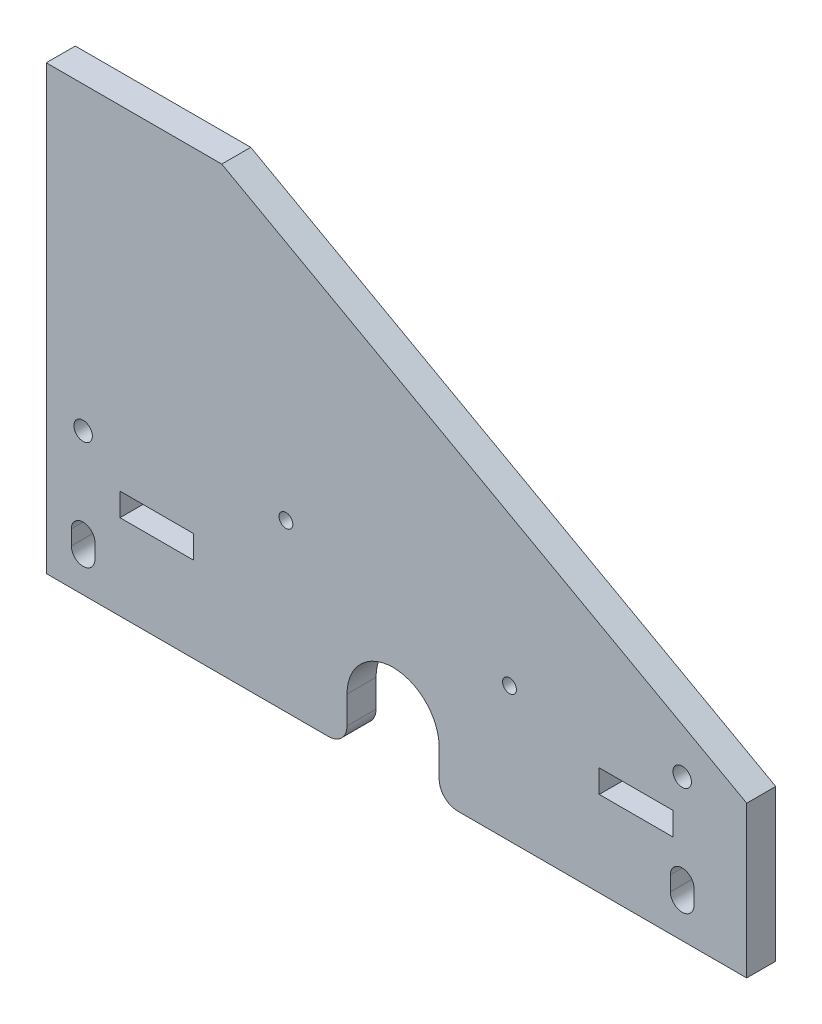
ISO-10303-21;
HEADER;
FILE_DESCRIPTION(('STEP AP214'),'2;1');
FILE_NAME('part.step','',(''),(''),'','','');
FILE_SCHEMA(('AUTOMOTIVE_DESIGN { 1 0 10303 214 1 1 1 1 }'));
ENDSEC;
DATA;
#1=APPLICATION_CONTEXT('core data for automotive mechanical design processes');
#2=APPLICATION_PROTOCOL_DEFINITION('international standard','automotive_design',2000,#1);
#3=PRODUCT_CONTEXT('',#1,'mechanical');
#4=PRODUCT('Part','Part','',(#3));
#5=PRODUCT_RELATED_PRODUCT_CATEGORY('part','',(#4));
#6=PRODUCT_DEFINITION_FORMATION('','',#4);
#7=PRODUCT_DEFINITION_CONTEXT('part definition',#1,'design');
#8=PRODUCT_DEFINITION('design','',#6,#7);
#9=PRODUCT_DEFINITION_SHAPE('','',#8);
#10=(LENGTH_UNIT() NAMED_UNIT(*) SI_UNIT(.MILLI.,.METRE.));
#11=(NAMED_UNIT(*) PLANE_ANGLE_UNIT() SI_UNIT($,.RADIAN.));
#12=(NAMED_UNIT(*) SI_UNIT($,.STERADIAN.) SOLID_ANGLE_UNIT());
#13=UNCERTAINTY_MEASURE_WITH_UNIT(LENGTH_MEASURE(1.E-05),#10,'distance_accuracy_value','');
#14=(GEOMETRIC_REPRESENTATION_CONTEXT(3) GLOBAL_UNCERTAINTY_ASSIGNED_CONTEXT((#13)) GLOBAL_UNIT_ASSIGNED_CONTEXT((#10,
#11,#12)) REPRESENTATION_CONTEXT('',''));
#15=CARTESIAN_POINT('',(0.,0.,0.));
#16=DIRECTION('',(0.,0.,1.));
#17=DIRECTION('',(1.,0.,0.));
#18=AXIS2_PLACEMENT_3D('',#15,#16,#17);
#19=CARTESIAN_POINT('',(-202.37863207058,-24.581916587002,10.));
#20=DIRECTION('',(0.,1.,0.));
#21=DIRECTION('',(0.,0.,1.));
#22=AXIS2_PLACEMENT_3D('',#19,#20,#21);
#23=PLANE('',#22);
#24=DIRECTION('',(0.,0.,1.));
#25=VECTOR('',#24,1.);
#26=CARTESIAN_POINT('',(-105.11949207058,-24.581916587002,0.));
#27=LINE('',#26,#25);
#28=CARTESIAN_POINT('',(-105.11949207058,-24.581916587002,0.));
#29=VERTEX_POINT('',#28);
#30=CARTESIAN_POINT('',(-105.11949207058,-24.581916587002,10.));
#31=VERTEX_POINT('',#30);
#32=EDGE_CURVE('E260',#29,#31,#27,.T.);
#33=ORIENTED_EDGE('',*,*,#32,.T.);
#34=DIRECTION('',(1.,0.,0.));
#35=VECTOR('',#34,1.);
#36=CARTESIAN_POINT('',(-202.37863207058,-24.581916587002,10.));
#37=LINE('',#36,#35);
#38=CARTESIAN_POINT('',(-202.37863207058,-24.581916587002,10.));
#39=VERTEX_POINT('',#38);
#40=EDGE_CURVE('E422',#39,#31,#37,.T.);
#41=ORIENTED_EDGE('',*,*,#40,.F.);
#42=DIRECTION('',(0.,0.,-1.));
#43=VECTOR('',#42,1.);
#44=CARTESIAN_POINT('',(-202.37863207058,-24.581916587002,10.));
#45=LINE('',#44,#43);
#46=CARTESIAN_POINT('',(-202.37863207058,-24.581916587002,0.));
#47=VERTEX_POINT('',#46);
#48=EDGE_CURVE('E439',#39,#47,#45,.T.);
#49=ORIENTED_EDGE('',*,*,#48,.T.);
#50=DIRECTION('',(1.,0.,0.));
#51=VECTOR('',#50,1.);
#52=CARTESIAN_POINT('',(-202.37863207058,-24.581916587002,0.));
#53=LINE('',#52,#51);
#54=EDGE_CURVE('E415',#47,#29,#53,.T.);
#55=ORIENTED_EDGE('',*,*,#54,.T.);
#56=EDGE_LOOP('',(#33,#41,#49,#55));
#57=FACE_BOUND('',#56,.T.);
#58=ADVANCED_FACE('F33',(#57),#23,.F.);
#59=CARTESIAN_POINT('',(38.9213679294199,27.5724000758674,10.));
#60=DIRECTION('',(-1.,0.,0.));
#61=DIRECTION('',(0.,0.,1.));
#62=AXIS2_PLACEMENT_3D('',#59,#60,#61);
#63=PLANE('',#62);
#64=DIRECTION('',(0.,1.,0.));
#65=VECTOR('',#64,1.);
#66=CARTESIAN_POINT('',(38.9213679294199,27.5724000758674,0.));
#67=LINE('',#66,#65);
#68=CARTESIAN_POINT('',(38.9213679294199,-24.581916587002,0.));
#69=VERTEX_POINT('',#68);
#70=CARTESIAN_POINT('',(38.9213679294199,27.5724000758674,0.));
#71=VERTEX_POINT('',#70);
#72=EDGE_CURVE('E410',#69,#71,#67,.T.);
#73=ORIENTED_EDGE('',*,*,#72,.T.);
#74=DIRECTION('',(0.,0.,-1.));
#75=VECTOR('',#74,1.);
#76=CARTESIAN_POINT('',(38.9213679294199,27.5724000758674,10.));
#77=LINE('',#76,#75);
#78=CARTESIAN_POINT('',(38.9213679294199,27.5724000758674,10.));
#79=VERTEX_POINT('',#78);
#80=EDGE_CURVE('E11',#79,#71,#77,.T.);
#81=ORIENTED_EDGE('',*,*,#80,.F.);
#82=DIRECTION('',(0.,1.,0.));
#83=VECTOR('',#82,1.);
#84=CARTESIAN_POINT('',(38.9213679294199,27.5724000758674,10.));
#85=LINE('',#84,#83);
#86=CARTESIAN_POINT('',(38.9213679294199,-24.581916587002,10.));
#87=VERTEX_POINT('',#86);
#88=EDGE_CURVE('E411',#87,#79,#85,.T.);
#89=ORIENTED_EDGE('',*,*,#88,.F.);
#90=DIRECTION('',(0.,0.,-1.));
#91=VECTOR('',#90,1.);
#92=CARTESIAN_POINT('',(38.9213679294199,-24.581916587002,10.));
#93=LINE('',#92,#91);
#94=EDGE_CURVE('E425',#87,#69,#93,.T.);
#95=ORIENTED_EDGE('',*,*,#94,.T.);
#96=EDGE_LOOP('',(#73,#81,#89,#95));
#97=FACE_BOUND('',#96,.T.);
#98=ADVANCED_FACE('F35',(#97),#63,.F.);
#99=CARTESIAN_POINT('',(-141.92663207058,127.818083412998,10.));
#100=DIRECTION('',(-0.484809620246338,-0.874619707139395,0.));
#101=DIRECTION('',(0.874619707139395,-0.484809620246338,0.));
#102=AXIS2_PLACEMENT_3D('',#99,#100,#101);
#103=PLANE('',#102);
#104=DIRECTION('',(-0.874619707139395,0.484809620246338,0.));
#105=VECTOR('',#104,1.);
#106=CARTESIAN_POINT('',(-141.92663207058,127.818083412998,0.));
#107=LINE('',#106,#105);
#108=CARTESIAN_POINT('',(-141.92663207058,127.818083412998,0.));
#109=VERTEX_POINT('',#108);
#110=EDGE_CURVE('E428',#71,#109,#107,.T.);
#111=ORIENTED_EDGE('',*,*,#110,.T.);
#112=DIRECTION('',(0.,0.,-1.));
#113=VECTOR('',#112,1.);
#114=CARTESIAN_POINT('',(-141.92663207058,127.818083412998,10.));
#115=LINE('',#114,#113);
#116=CARTESIAN_POINT('',(-141.92663207058,127.818083412998,10.));
#117=VERTEX_POINT('',#116);
#118=EDGE_CURVE('E41',#117,#109,#115,.T.);
#119=ORIENTED_EDGE('',*,*,#118,.F.);
#120=DIRECTION('',(-0.874619707139395,0.484809620246338,0.));
#121=VECTOR('',#120,1.);
#122=CARTESIAN_POINT('',(-141.92663207058,127.818083412998,10.));
#123=LINE('',#122,#121);
#124=EDGE_CURVE('E414',#79,#117,#123,.T.);
#125=ORIENTED_EDGE('',*,*,#124,.F.);
#126=ORIENTED_EDGE('',*,*,#80,.T.);
#127=EDGE_LOOP('',(#111,#119,#125,#126));
#128=FACE_BOUND('',#127,.T.);
#129=ADVANCED_FACE('F468',(#128),#103,.F.);
#130=CARTESIAN_POINT('',(-202.37863207058,127.818083412998,10.));
#131=DIRECTION('',(0.,-1.,0.));
#132=DIRECTION('',(0.,0.,-1.));
#133=AXIS2_PLACEMENT_3D('',#130,#131,#132);
#134=PLANE('',#133);
#135=DIRECTION('',(-1.,0.,0.));
#136=VECTOR('',#135,1.);
#137=CARTESIAN_POINT('',(-202.37863207058,127.818083412998,0.));
#138=LINE('',#137,#136);
#139=CARTESIAN_POINT('',(-202.37863207058,127.818083412998,0.));
#140=VERTEX_POINT('',#139);
#141=EDGE_CURVE('E430',#109,#140,#138,.T.);
#142=ORIENTED_EDGE('',*,*,#141,.T.);
#143=DIRECTION('',(0.,0.,-1.));
#144=VECTOR('',#143,1.);
#145=CARTESIAN_POINT('',(-202.37863207058,127.818083412998,10.));
#146=LINE('',#145,#144);
#147=CARTESIAN_POINT('',(-202.37863207058,127.818083412998,10.));
#148=VERTEX_POINT('',#147);
#149=EDGE_CURVE('E442',#148,#140,#146,.T.);
#150=ORIENTED_EDGE('',*,*,#149,.F.);
#151=DIRECTION('',(-1.,0.,0.));
#152=VECTOR('',#151,1.);
#153=CARTESIAN_POINT('',(-202.37863207058,127.818083412998,10.));
#154=LINE('',#153,#152);
#155=EDGE_CURVE('E417',#117,#148,#154,.T.);
#156=ORIENTED_EDGE('',*,*,#155,.F.);
#157=ORIENTED_EDGE('',*,*,#118,.T.);
#158=EDGE_LOOP('',(#142,#150,#156,#157));
#159=FACE_BOUND('',#158,.T.);
#160=ADVANCED_FACE('F449',(#159),#134,.F.);
#161=CARTESIAN_POINT('',(-202.37863207058,127.818083412998,10.));
#162=DIRECTION('',(1.,0.,0.));
#163=DIRECTION('',(0.,1.,0.));
#164=AXIS2_PLACEMENT_3D('',#161,#162,#163);
#165=PLANE('',#164);
#166=DIRECTION('',(0.,-1.,0.));
#167=VECTOR('',#166,1.);
#168=CARTESIAN_POINT('',(-202.37863207058,127.818083412998,0.));
#169=LINE('',#168,#167);
#170=EDGE_CURVE('E432',#140,#47,#169,.T.);
#171=ORIENTED_EDGE('',*,*,#170,.T.);
#172=ORIENTED_EDGE('',*,*,#48,.F.);
#173=DIRECTION('',(0.,-1.,0.));
#174=VECTOR('',#173,1.);
#175=CARTESIAN_POINT('',(-202.37863207058,127.818083412998,10.));
#176=LINE('',#175,#174);
#177=EDGE_CURVE('E419',#148,#39,#176,.T.);
#178=ORIENTED_EDGE('',*,*,#177,.F.);
#179=ORIENTED_EDGE('',*,*,#149,.T.);
#180=EDGE_LOOP('',(#171,#172,#178,#179));
#181=FACE_BOUND('',#180,.T.);
#182=ADVANCED_FACE('F457',(#181),#165,.F.);
#183=CARTESIAN_POINT('',(-60.6694920705801,-24.581916587002,10.));
#184=VERTEX_POINT('',#183);
#185=EDGE_CURVE('E421',#184,#87,#37,.T.);
#186=ORIENTED_EDGE('',*,*,#185,.F.);
#187=DIRECTION('',(0.,0.,1.));
#188=VECTOR('',#187,1.);
#189=CARTESIAN_POINT('',(-60.6694920705801,-24.581916587002,0.));
#190=LINE('',#189,#188);
#191=CARTESIAN_POINT('',(-60.6694920705801,-24.581916587002,0.));
#192=VERTEX_POINT('',#191);
#193=EDGE_CURVE('E258',#192,#184,#190,.T.);
#194=ORIENTED_EDGE('',*,*,#193,.F.);
#195=EDGE_CURVE('E434',#192,#69,#53,.T.);
#196=ORIENTED_EDGE('',*,*,#195,.T.);
#197=ORIENTED_EDGE('',*,*,#94,.F.);
#198=EDGE_LOOP('',(#186,#194,#196,#197));
#199=FACE_BOUND('',#198,.T.);
#200=ADVANCED_FACE('F474',(#199),#23,.F.);
#201=CARTESIAN_POINT('',(38.9213679294199,-24.581916587002,10.));
#202=DIRECTION('',(0.,0.,1.));
#203=DIRECTION('',(1.,0.,0.));
#204=AXIS2_PLACEMENT_3D('',#201,#202,#203);
#205=PLANE('',#204);
#206=CARTESIAN_POINT('',(-60.6694920705801,-18.231916587002,10.));
#207=DIRECTION('',(0.,0.,-1.));
#208=DIRECTION('',(1.,0.,0.));
#209=AXIS2_PLACEMENT_3D('',#206,#207,#208);
#210=CIRCLE('',#209,6.35);
#211=CARTESIAN_POINT('',(-67.0194920705801,-18.231916587002,10.));
#212=VERTEX_POINT('',#211);
#213=EDGE_CURVE('E239',#184,#212,#210,.T.);
#214=ORIENTED_EDGE('',*,*,#213,.F.);
#215=ORIENTED_EDGE('',*,*,#185,.T.);
#216=ORIENTED_EDGE('',*,*,#88,.T.);
#217=ORIENTED_EDGE('',*,*,#124,.T.);
#218=ORIENTED_EDGE('',*,*,#155,.T.);
#219=ORIENTED_EDGE('',*,*,#177,.T.);
#220=ORIENTED_EDGE('',*,*,#40,.T.);
#221=CARTESIAN_POINT('',(-105.11949207058,-18.231916587002,10.));
#222=DIRECTION('',(0.,0.,-1.));
#223=DIRECTION('',(1.,0.,0.));
#224=AXIS2_PLACEMENT_3D('',#221,#222,#223);
#225=CIRCLE('',#224,6.35);
#226=CARTESIAN_POINT('',(-98.7694920705801,-18.231916587002,10.));
#227=VERTEX_POINT('',#226);
#228=EDGE_CURVE('E249',#227,#31,#225,.T.);
#229=ORIENTED_EDGE('',*,*,#228,.F.);
#230=DIRECTION('',(0.,-1.,0.));
#231=VECTOR('',#230,1.);
#232=CARTESIAN_POINT('',(-98.7694920705801,-8.70691658700201,10.));
#233=LINE('',#232,#231);
#234=CARTESIAN_POINT('',(-98.7694920705801,-8.70691658700201,10.));
#235=VERTEX_POINT('',#234);
#236=EDGE_CURVE('E247',#235,#227,#233,.T.);
#237=ORIENTED_EDGE('',*,*,#236,.F.);
#238=CARTESIAN_POINT('',(-82.8944920705801,-8.70691658700201,10.));
#239=DIRECTION('',(0.,0.,1.));
#240=DIRECTION('',(1.,0.,0.));
#241=AXIS2_PLACEMENT_3D('',#238,#239,#240);
#242=CIRCLE('',#241,15.875);
#243=CARTESIAN_POINT('',(-67.0194920705801,-8.70691658700201,10.));
#244=VERTEX_POINT('',#243);
#245=EDGE_CURVE('E219',#244,#235,#242,.T.);
#246=ORIENTED_EDGE('',*,*,#245,.F.);
#247=DIRECTION('',(0.,1.,0.));
#248=VECTOR('',#247,1.);
#249=CARTESIAN_POINT('',(-67.0194920705801,-8.70691658700201,10.));
#250=LINE('',#249,#248);
#251=EDGE_CURVE('E236',#212,#244,#250,.T.);
#252=ORIENTED_EDGE('',*,*,#251,.F.);
#253=EDGE_LOOP('',(#214,#215,#216,#217,#218,#219,#220,#229,#237,#246,#252));
#254=FACE_BOUND('',#253,.T.);
#255=CARTESIAN_POINT('',(16.6963679294199,24.358803412998,10.));
#256=DIRECTION('',(0.,0.,1.));
#257=DIRECTION('',(1.,0.,0.));
#258=AXIS2_PLACEMENT_3D('',#255,#256,#257);
#259=CIRCLE('',#258,3.175);
#260=CARTESIAN_POINT('',(19.8713679294199,24.358803412998,10.));
#261=VERTEX_POINT('',#260);
#262=EDGE_CURVE('E255',#261,#261,#259,.T.);
#263=ORIENTED_EDGE('',*,*,#262,.F.);
#264=EDGE_LOOP('',(#263));
#265=FACE_BOUND('',#264,.T.);
#266=CARTESIAN_POINT('',(16.6963679294199,-12.008916587002,10.));
#267=DIRECTION('',(0.,0.,1.));
#268=DIRECTION('',(1.,0.,0.));
#269=AXIS2_PLACEMENT_3D('',#266,#267,#268);
#270=CIRCLE('',#269,4.06400000000003);
#271=CARTESIAN_POINT('',(12.6323679294199,-12.008916587002,10.));
#272=VERTEX_POINT('',#271);
#273=CARTESIAN_POINT('',(20.76036792942,-12.008916587002,10.));
#274=VERTEX_POINT('',#273);
#275=EDGE_CURVE('E56',#272,#274,#270,.T.);
#276=ORIENTED_EDGE('',*,*,#275,.F.);
#277=DIRECTION('',(0.,-1.,0.));
#278=VECTOR('',#277,1.);
#279=CARTESIAN_POINT('',(12.6323679294199,-12.008916587002,10.));
#280=LINE('',#279,#278);
#281=CARTESIAN_POINT('',(12.6323679294199,-6.92891658700202,10.));
#282=VERTEX_POINT('',#281);
#283=EDGE_CURVE('E284',#282,#272,#280,.T.);
#284=ORIENTED_EDGE('',*,*,#283,.F.);
#285=CARTESIAN_POINT('',(16.6963679294199,-6.92891658700202,10.));
#286=DIRECTION('',(0.,0.,1.));
#287=DIRECTION('',(1.,0.,0.));
#288=AXIS2_PLACEMENT_3D('',#285,#286,#287);
#289=CIRCLE('',#288,4.06400000000004);
#290=CARTESIAN_POINT('',(20.76036792942,-6.92891658700202,10.));
#291=VERTEX_POINT('',#290);
#292=EDGE_CURVE('E281',#291,#282,#289,.T.);
#293=ORIENTED_EDGE('',*,*,#292,.F.);
#294=DIRECTION('',(0.,1.,0.));
#295=VECTOR('',#294,1.);
#296=CARTESIAN_POINT('',(20.76036792942,-6.92891658700202,10.));
#297=LINE('',#296,#295);
#298=EDGE_CURVE('E278',#274,#291,#297,.T.);
#299=ORIENTED_EDGE('',*,*,#298,.F.);
#300=EDGE_LOOP('',(#276,#284,#293,#299));
#301=FACE_BOUND('',#300,.T.);
#302=DIRECTION('',(0.,1.,0.));
#303=VECTOR('',#302,1.);
#304=CARTESIAN_POINT('',(13.5213679294199,12.725603412998,10.));
#305=LINE('',#304,#303);
#306=CARTESIAN_POINT('',(13.5213679294199,4.78810341299798,10.));
#307=VERTEX_POINT('',#306);
#308=CARTESIAN_POINT('',(13.5213679294199,12.725603412998,10.));
#309=VERTEX_POINT('',#308);
#310=EDGE_CURVE('E298',#307,#309,#305,.T.);
#311=ORIENTED_EDGE('',*,*,#310,.F.);
#312=DIRECTION('',(1.,0.,0.));
#313=VECTOR('',#312,1.);
#314=CARTESIAN_POINT('',(13.5213679294199,4.78810341299798,10.));
#315=LINE('',#314,#313);
#316=CARTESIAN_POINT('',(-11.87863207058,4.78810341299798,10.));
#317=VERTEX_POINT('',#316);
#318=EDGE_CURVE('E303',#317,#307,#315,.T.);
#319=ORIENTED_EDGE('',*,*,#318,.F.);
#320=DIRECTION('',(0.,-1.,0.));
#321=VECTOR('',#320,1.);
#322=CARTESIAN_POINT('',(-11.87863207058,12.725603412998,10.));
#323=LINE('',#322,#321);
#324=CARTESIAN_POINT('',(-11.87863207058,12.725603412998,10.));
#325=VERTEX_POINT('',#324);
#326=EDGE_CURVE('E317',#325,#317,#323,.T.);
#327=ORIENTED_EDGE('',*,*,#326,.F.);
#328=DIRECTION('',(-1.,0.,0.));
#329=VECTOR('',#328,1.);
#330=CARTESIAN_POINT('',(13.5213679294199,12.725603412998,10.));
#331=LINE('',#330,#329);
#332=EDGE_CURVE('E314',#309,#325,#331,.T.);
#333=ORIENTED_EDGE('',*,*,#332,.F.);
#334=EDGE_LOOP('',(#311,#319,#327,#333));
#335=FACE_BOUND('',#334,.T.);
#336=CARTESIAN_POINT('',(-42.7929720705801,21.773083412998,10.));
#337=DIRECTION('',(0.,0.,1.));
#338=DIRECTION('',(1.,0.,0.));
#339=AXIS2_PLACEMENT_3D('',#336,#337,#338);
#340=CIRCLE('',#339,2.38125000000001);
#341=CARTESIAN_POINT('',(-40.4117220705801,21.773083412998,10.));
#342=VERTEX_POINT('',#341);
#343=EDGE_CURVE('E324',#342,#342,#340,.T.);
#344=ORIENTED_EDGE('',*,*,#343,.F.);
#345=EDGE_LOOP('',(#344));
#346=FACE_BOUND('',#345,.T.);
#347=CARTESIAN_POINT('',(-119.82863207058,32.568083412998,10.));
#348=DIRECTION('',(0.,0.,1.));
#349=DIRECTION('',(1.,0.,0.));
#350=AXIS2_PLACEMENT_3D('',#347,#348,#349);
#351=CIRCLE('',#350,2.38125);
#352=CARTESIAN_POINT('',(-117.44738207058,32.568083412998,10.));
#353=VERTEX_POINT('',#352);
#354=EDGE_CURVE('E334',#353,#353,#351,.T.);
#355=ORIENTED_EDGE('',*,*,#354,.F.);
#356=EDGE_LOOP('',(#355));
#357=FACE_BOUND('',#356,.T.);
#358=CARTESIAN_POINT('',(-189.67863207058,24.358803412998,10.));
#359=DIRECTION('',(0.,0.,1.));
#360=DIRECTION('',(1.,0.,0.));
#361=AXIS2_PLACEMENT_3D('',#358,#359,#360);
#362=CIRCLE('',#361,3.175);
#363=CARTESIAN_POINT('',(-186.50363207058,24.358803412998,10.));
#364=VERTEX_POINT('',#363);
#365=EDGE_CURVE('E340',#364,#364,#362,.T.);
#366=ORIENTED_EDGE('',*,*,#365,.F.);
#367=EDGE_LOOP('',(#366));
#368=FACE_BOUND('',#367,.T.);
#369=CARTESIAN_POINT('',(-189.67863207058,-12.008916587002,10.));
#370=DIRECTION('',(0.,0.,1.));
#371=DIRECTION('',(1.,0.,0.));
#372=AXIS2_PLACEMENT_3D('',#369,#370,#371);
#373=CIRCLE('',#372,4.06400000000003);
#374=CARTESIAN_POINT('',(-193.74263207058,-12.008916587002,10.));
#375=VERTEX_POINT('',#374);
#376=CARTESIAN_POINT('',(-185.61463207058,-12.008916587002,10.));
#377=VERTEX_POINT('',#376);
#378=EDGE_CURVE('E356',#375,#377,#373,.T.);
#379=ORIENTED_EDGE('',*,*,#378,.F.);
#380=DIRECTION('',(0.,-1.,0.));
#381=VECTOR('',#380,1.);
#382=CARTESIAN_POINT('',(-193.74263207058,-12.008916587002,10.));
#383=LINE('',#382,#381);
#384=CARTESIAN_POINT('',(-193.74263207058,-6.92891658700202,10.));
#385=VERTEX_POINT('',#384);
#386=EDGE_CURVE('E364',#385,#375,#383,.T.);
#387=ORIENTED_EDGE('',*,*,#386,.F.);
#388=CARTESIAN_POINT('',(-189.67863207058,-6.92891658700202,10.));
#389=DIRECTION('',(0.,0.,1.));
#390=DIRECTION('',(1.,0.,0.));
#391=AXIS2_PLACEMENT_3D('',#388,#389,#390);
#392=CIRCLE('',#391,4.06400000000004);
#393=CARTESIAN_POINT('',(-185.61463207058,-6.92891658700202,10.));
#394=VERTEX_POINT('',#393);
#395=EDGE_CURVE('E361',#394,#385,#392,.T.);
#396=ORIENTED_EDGE('',*,*,#395,.F.);
#397=DIRECTION('',(0.,1.,0.));
#398=VECTOR('',#397,1.);
#399=CARTESIAN_POINT('',(-185.61463207058,-6.92891658700202,10.));
#400=LINE('',#399,#398);
#401=EDGE_CURVE('E358',#377,#394,#400,.T.);
#402=ORIENTED_EDGE('',*,*,#401,.F.);
#403=EDGE_LOOP('',(#379,#387,#396,#402));
#404=FACE_BOUND('',#403,.T.);
#405=DIRECTION('',(0.,-1.,0.));
#406=VECTOR('',#405,1.);
#407=CARTESIAN_POINT('',(-176.97863207058,4.78810341299798,10.));
#408=LINE('',#407,#406);
#409=CARTESIAN_POINT('',(-176.97863207058,12.725603412998,10.));
#410=VERTEX_POINT('',#409);
#411=CARTESIAN_POINT('',(-176.97863207058,4.78810341299798,10.));
#412=VERTEX_POINT('',#411);
#413=EDGE_CURVE('E387',#410,#412,#408,.T.);
#414=ORIENTED_EDGE('',*,*,#413,.F.);
#415=DIRECTION('',(-1.,0.,0.));
#416=VECTOR('',#415,1.);
#417=CARTESIAN_POINT('',(-176.97863207058,12.725603412998,10.));
#418=LINE('',#417,#416);
#419=CARTESIAN_POINT('',(-151.57863207058,12.725603412998,10.));
#420=VERTEX_POINT('',#419);
#421=EDGE_CURVE('E395',#420,#410,#418,.T.);
#422=ORIENTED_EDGE('',*,*,#421,.F.);
#423=DIRECTION('',(0.,1.,0.));
#424=VECTOR('',#423,1.);
#425=CARTESIAN_POINT('',(-151.57863207058,4.78810341299798,10.));
#426=LINE('',#425,#424);
#427=CARTESIAN_POINT('',(-151.57863207058,4.78810341299798,10.));
#428=VERTEX_POINT('',#427);
#429=EDGE_CURVE('E392',#428,#420,#426,.T.);
#430=ORIENTED_EDGE('',*,*,#429,.F.);
#431=DIRECTION('',(1.,0.,0.));
#432=VECTOR('',#431,1.);
#433=CARTESIAN_POINT('',(-176.97863207058,4.78810341299798,10.));
#434=LINE('',#433,#432);
#435=EDGE_CURVE('E389',#412,#428,#434,.T.);
#436=ORIENTED_EDGE('',*,*,#435,.F.);
#437=EDGE_LOOP('',(#414,#422,#430,#436));
#438=FACE_BOUND('',#437,.T.);
#439=ADVANCED_FACE('F464',(#254,#265,#301,#335,#346,#357,#368,#404,#438),#205,.T.);
#440=CARTESIAN_POINT('',(38.9213679294199,-24.581916587002,0.));
#441=DIRECTION('',(0.,0.,1.));
#442=DIRECTION('',(1.,0.,0.));
#443=AXIS2_PLACEMENT_3D('',#440,#441,#442);
#444=PLANE('',#443);
#445=ORIENTED_EDGE('',*,*,#195,.F.);
#446=CARTESIAN_POINT('',(-60.6694920705801,-18.231916587002,0.));
#447=DIRECTION('',(0.,0.,-1.));
#448=DIRECTION('',(1.,0.,0.));
#449=AXIS2_PLACEMENT_3D('',#446,#447,#448);
#450=CIRCLE('',#449,6.35);
#451=CARTESIAN_POINT('',(-67.0194920705801,-18.231916587002,0.));
#452=VERTEX_POINT('',#451);
#453=EDGE_CURVE('E243',#192,#452,#450,.T.);
#454=ORIENTED_EDGE('',*,*,#453,.T.);
#455=DIRECTION('',(0.,1.,0.));
#456=VECTOR('',#455,1.);
#457=CARTESIAN_POINT('',(-67.0194920705801,-8.70691658700201,0.));
#458=LINE('',#457,#456);
#459=CARTESIAN_POINT('',(-67.0194920705801,-8.70691658700201,0.));
#460=VERTEX_POINT('',#459);
#461=EDGE_CURVE('E224',#452,#460,#458,.T.);
#462=ORIENTED_EDGE('',*,*,#461,.T.);
#463=CARTESIAN_POINT('',(-82.8944920705801,-8.70691658700201,0.));
#464=DIRECTION('',(0.,0.,1.));
#465=DIRECTION('',(1.,0.,0.));
#466=AXIS2_PLACEMENT_3D('',#463,#464,#465);
#467=CIRCLE('',#466,15.875);
#468=CARTESIAN_POINT('',(-98.7694920705801,-8.70691658700201,0.));
#469=VERTEX_POINT('',#468);
#470=EDGE_CURVE('E216',#460,#469,#467,.T.);
#471=ORIENTED_EDGE('',*,*,#470,.T.);
#472=DIRECTION('',(0.,-1.,0.));
#473=VECTOR('',#472,1.);
#474=CARTESIAN_POINT('',(-98.7694920705801,-8.70691658700201,0.));
#475=LINE('',#474,#473);
#476=CARTESIAN_POINT('',(-98.7694920705801,-18.231916587002,0.));
#477=VERTEX_POINT('',#476);
#478=EDGE_CURVE('E227',#469,#477,#475,.T.);
#479=ORIENTED_EDGE('',*,*,#478,.T.);
#480=CARTESIAN_POINT('',(-105.11949207058,-18.231916587002,0.));
#481=DIRECTION('',(0.,0.,-1.));
#482=DIRECTION('',(1.,0.,0.));
#483=AXIS2_PLACEMENT_3D('',#480,#481,#482);
#484=CIRCLE('',#483,6.35);
#485=EDGE_CURVE('E48',#477,#29,#484,.T.);
#486=ORIENTED_EDGE('',*,*,#485,.T.);
#487=ORIENTED_EDGE('',*,*,#54,.F.);
#488=ORIENTED_EDGE('',*,*,#170,.F.);
#489=ORIENTED_EDGE('',*,*,#141,.F.);
#490=ORIENTED_EDGE('',*,*,#110,.F.);
#491=ORIENTED_EDGE('',*,*,#72,.F.);
#492=EDGE_LOOP('',(#445,#454,#462,#471,#479,#486,#487,#488,#489,#490,#491));
#493=FACE_BOUND('',#492,.T.);
#494=CARTESIAN_POINT('',(16.6963679294199,24.358803412998,0.));
#495=DIRECTION('',(0.,0.,1.));
#496=DIRECTION('',(1.,0.,0.));
#497=AXIS2_PLACEMENT_3D('',#494,#495,#496);
#498=CIRCLE('',#497,3.175);
#499=CARTESIAN_POINT('',(19.8713679294199,24.358803412998,0.));
#500=VERTEX_POINT('',#499);
#501=EDGE_CURVE('E264',#500,#500,#498,.T.);
#502=ORIENTED_EDGE('',*,*,#501,.T.);
#503=EDGE_LOOP('',(#502));
#504=FACE_BOUND('',#503,.T.);
#505=DIRECTION('',(0.,1.,0.));
#506=VECTOR('',#505,1.);
#507=CARTESIAN_POINT('',(12.6323679294199,-12.008916587002,0.));
#508=LINE('',#507,#506);
#509=CARTESIAN_POINT('',(12.6323679294199,-12.008916587002,0.));
#510=VERTEX_POINT('',#509);
#511=CARTESIAN_POINT('',(12.6323679294199,-6.92891658700202,0.));
#512=VERTEX_POINT('',#511);
#513=EDGE_CURVE('E271',#510,#512,#508,.T.);
#514=ORIENTED_EDGE('',*,*,#513,.F.);
#515=CARTESIAN_POINT('',(16.6963679294199,-12.008916587002,0.));
#516=DIRECTION('',(0.,0.,1.));
#517=DIRECTION('',(1.,0.,0.));
#518=AXIS2_PLACEMENT_3D('',#515,#516,#517);
#519=CIRCLE('',#518,4.06400000000003);
#520=CARTESIAN_POINT('',(20.76036792942,-12.008916587002,0.));
#521=VERTEX_POINT('',#520);
#522=EDGE_CURVE('E274',#521,#510,#519,.F.);
#523=ORIENTED_EDGE('',*,*,#522,.F.);
#524=DIRECTION('',(0.,-1.,0.));
#525=VECTOR('',#524,1.);
#526=CARTESIAN_POINT('',(20.76036792942,-6.92891658700202,0.));
#527=LINE('',#526,#525);
#528=CARTESIAN_POINT('',(20.76036792942,-6.92891658700202,0.));
#529=VERTEX_POINT('',#528);
#530=EDGE_CURVE('E290',#529,#521,#527,.T.);
#531=ORIENTED_EDGE('',*,*,#530,.F.);
#532=CARTESIAN_POINT('',(16.6963679294199,-6.92891658700202,0.));
#533=DIRECTION('',(0.,0.,1.));
#534=DIRECTION('',(1.,0.,0.));
#535=AXIS2_PLACEMENT_3D('',#532,#533,#534);
#536=CIRCLE('',#535,4.06400000000004);
#537=EDGE_CURVE('E267',#512,#529,#536,.F.);
#538=ORIENTED_EDGE('',*,*,#537,.F.);
#539=EDGE_LOOP('',(#514,#523,#531,#538));
#540=FACE_BOUND('',#539,.T.);
#541=DIRECTION('',(1.,0.,0.));
#542=VECTOR('',#541,1.);
#543=CARTESIAN_POINT('',(13.5213679294199,4.78810341299798,0.));
#544=LINE('',#543,#542);
#545=CARTESIAN_POINT('',(-11.87863207058,4.78810341299798,0.));
#546=VERTEX_POINT('',#545);
#547=CARTESIAN_POINT('',(13.5213679294199,4.78810341299798,0.));
#548=VERTEX_POINT('',#547);
#549=EDGE_CURVE('E309',#546,#548,#544,.T.);
#550=ORIENTED_EDGE('',*,*,#549,.T.);
#551=DIRECTION('',(0.,1.,0.));
#552=VECTOR('',#551,1.);
#553=CARTESIAN_POINT('',(13.5213679294199,12.725603412998,0.));
#554=LINE('',#553,#552);
#555=CARTESIAN_POINT('',(13.5213679294199,12.725603412998,0.));
#556=VERTEX_POINT('',#555);
#557=EDGE_CURVE('E299',#548,#556,#554,.T.);
#558=ORIENTED_EDGE('',*,*,#557,.T.);
#559=DIRECTION('',(-1.,0.,0.));
#560=VECTOR('',#559,1.);
#561=CARTESIAN_POINT('',(13.5213679294199,12.725603412998,0.));
#562=LINE('',#561,#560);
#563=CARTESIAN_POINT('',(-11.87863207058,12.725603412998,0.));
#564=VERTEX_POINT('',#563);
#565=EDGE_CURVE('E302',#556,#564,#562,.T.);
#566=ORIENTED_EDGE('',*,*,#565,.T.);
#567=DIRECTION('',(0.,-1.,0.));
#568=VECTOR('',#567,1.);
#569=CARTESIAN_POINT('',(-11.87863207058,12.725603412998,0.));
#570=LINE('',#569,#568);
#571=EDGE_CURVE('E306',#564,#546,#570,.T.);
#572=ORIENTED_EDGE('',*,*,#571,.T.);
#573=EDGE_LOOP('',(#550,#558,#566,#572));
#574=FACE_BOUND('',#573,.T.);
#575=CARTESIAN_POINT('',(-42.7929720705801,21.773083412998,0.));
#576=DIRECTION('',(0.,0.,1.));
#577=DIRECTION('',(1.,0.,0.));
#578=AXIS2_PLACEMENT_3D('',#575,#576,#577);
#579=CIRCLE('',#578,2.38125000000001);
#580=CARTESIAN_POINT('',(-40.4117220705801,21.773083412998,0.));
#581=VERTEX_POINT('',#580);
#582=EDGE_CURVE('E331',#581,#581,#579,.T.);
#583=ORIENTED_EDGE('',*,*,#582,.T.);
#584=EDGE_LOOP('',(#583));
#585=FACE_BOUND('',#584,.T.);
#586=CARTESIAN_POINT('',(-119.82863207058,32.568083412998,0.));
#587=DIRECTION('',(0.,0.,1.));
#588=DIRECTION('',(1.,0.,0.));
#589=AXIS2_PLACEMENT_3D('',#586,#587,#588);
#590=CIRCLE('',#589,2.38125);
#591=CARTESIAN_POINT('',(-117.44738207058,32.568083412998,0.));
#592=VERTEX_POINT('',#591);
#593=EDGE_CURVE('E337',#592,#592,#590,.T.);
#594=ORIENTED_EDGE('',*,*,#593,.T.);
#595=EDGE_LOOP('',(#594));
#596=FACE_BOUND('',#595,.T.);
#597=CARTESIAN_POINT('',(-189.67863207058,24.358803412998,0.));
#598=DIRECTION('',(0.,0.,1.));
#599=DIRECTION('',(1.,0.,0.));
#600=AXIS2_PLACEMENT_3D('',#597,#598,#599);
#601=CIRCLE('',#600,3.175);
#602=CARTESIAN_POINT('',(-186.50363207058,24.358803412998,0.));
#603=VERTEX_POINT('',#602);
#604=EDGE_CURVE('E343',#603,#603,#601,.T.);
#605=ORIENTED_EDGE('',*,*,#604,.T.);
#606=EDGE_LOOP('',(#605));
#607=FACE_BOUND('',#606,.T.);
#608=DIRECTION('',(0.,1.,0.));
#609=VECTOR('',#608,1.);
#610=CARTESIAN_POINT('',(-193.74263207058,-12.008916587002,0.));
#611=LINE('',#610,#609);
#612=CARTESIAN_POINT('',(-193.74263207058,-12.008916587002,0.));
#613=VERTEX_POINT('',#612);
#614=CARTESIAN_POINT('',(-193.74263207058,-6.92891658700202,0.));
#615=VERTEX_POINT('',#614);
#616=EDGE_CURVE('E350',#613,#615,#611,.T.);
#617=ORIENTED_EDGE('',*,*,#616,.F.);
#618=CARTESIAN_POINT('',(-189.67863207058,-12.008916587002,0.));
#619=DIRECTION('',(0.,0.,1.));
#620=DIRECTION('',(1.,0.,0.));
#621=AXIS2_PLACEMENT_3D('',#618,#619,#620);
#622=CIRCLE('',#621,4.06400000000003);
#623=CARTESIAN_POINT('',(-185.61463207058,-12.008916587002,0.));
#624=VERTEX_POINT('',#623);
#625=EDGE_CURVE('E353',#624,#613,#622,.F.);
#626=ORIENTED_EDGE('',*,*,#625,.F.);
#627=DIRECTION('',(0.,-1.,0.));
#628=VECTOR('',#627,1.);
#629=CARTESIAN_POINT('',(-185.61463207058,-6.92891658700202,0.));
#630=LINE('',#629,#628);
#631=CARTESIAN_POINT('',(-185.61463207058,-6.92891658700202,0.));
#632=VERTEX_POINT('',#631);
#633=EDGE_CURVE('E370',#632,#624,#630,.T.);
#634=ORIENTED_EDGE('',*,*,#633,.F.);
#635=CARTESIAN_POINT('',(-189.67863207058,-6.92891658700202,0.));
#636=DIRECTION('',(0.,0.,1.));
#637=DIRECTION('',(1.,0.,0.));
#638=AXIS2_PLACEMENT_3D('',#635,#636,#637);
#639=CIRCLE('',#638,4.06400000000004);
#640=EDGE_CURVE('E346',#615,#632,#639,.F.);
#641=ORIENTED_EDGE('',*,*,#640,.F.);
#642=EDGE_LOOP('',(#617,#626,#634,#641));
#643=FACE_BOUND('',#642,.T.);
#644=DIRECTION('',(1.,0.,0.));
#645=VECTOR('',#644,1.);
#646=CARTESIAN_POINT('',(-176.97863207058,12.725603412998,0.));
#647=LINE('',#646,#645);
#648=CARTESIAN_POINT('',(-176.97863207058,12.725603412998,0.));
#649=VERTEX_POINT('',#648);
#650=CARTESIAN_POINT('',(-151.57863207058,12.725603412998,0.));
#651=VERTEX_POINT('',#650);
#652=EDGE_CURVE('E381',#649,#651,#647,.T.);
#653=ORIENTED_EDGE('',*,*,#652,.F.);
#654=DIRECTION('',(0.,1.,0.));
#655=VECTOR('',#654,1.);
#656=CARTESIAN_POINT('',(-176.97863207058,4.78810341299798,0.));
#657=LINE('',#656,#655);
#658=CARTESIAN_POINT('',(-176.97863207058,4.78810341299798,0.));
#659=VERTEX_POINT('',#658);
#660=EDGE_CURVE('E384',#659,#649,#657,.T.);
#661=ORIENTED_EDGE('',*,*,#660,.F.);
#662=DIRECTION('',(-1.,0.,0.));
#663=VECTOR('',#662,1.);
#664=CARTESIAN_POINT('',(-176.97863207058,4.78810341299798,0.));
#665=LINE('',#664,#663);
#666=CARTESIAN_POINT('',(-151.57863207058,4.78810341299798,0.));
#667=VERTEX_POINT('',#666);
#668=EDGE_CURVE('E401',#667,#659,#665,.T.);
#669=ORIENTED_EDGE('',*,*,#668,.F.);
#670=DIRECTION('',(0.,-1.,0.));
#671=VECTOR('',#670,1.);
#672=CARTESIAN_POINT('',(-151.57863207058,4.78810341299798,0.));
#673=LINE('',#672,#671);
#674=EDGE_CURVE('E379',#651,#667,#673,.T.);
#675=ORIENTED_EDGE('',*,*,#674,.F.);
#676=EDGE_LOOP('',(#653,#661,#669,#675));
#677=FACE_BOUND('',#676,.T.);
#678=ADVANCED_FACE('F232',(#493,#504,#540,#574,#585,#596,#607,#643,#677),#444,.F.);
#679=CARTESIAN_POINT('',(-176.97863207058,4.78810341299798,-0.000999999999999265));
#680=DIRECTION('',(-1.,0.,0.));
#681=DIRECTION('',(0.,0.,1.));
#682=AXIS2_PLACEMENT_3D('',#679,#680,#681);
#683=PLANE('',#682);
#684=ORIENTED_EDGE('',*,*,#660,.T.);
#685=DIRECTION('',(0.,0.,1.));
#686=VECTOR('',#685,1.);
#687=CARTESIAN_POINT('',(-176.97863207058,12.725603412998,-0.000999999999999265));
#688=LINE('',#687,#686);
#689=EDGE_CURVE('E399',#649,#410,#688,.T.);
#690=ORIENTED_EDGE('',*,*,#689,.T.);
#691=ORIENTED_EDGE('',*,*,#413,.T.);
#692=DIRECTION('',(0.,0.,1.));
#693=VECTOR('',#692,1.);
#694=CARTESIAN_POINT('',(-176.97863207058,4.78810341299798,-0.000999999999999265));
#695=LINE('',#694,#693);
#696=EDGE_CURVE('E398',#659,#412,#695,.T.);
#697=ORIENTED_EDGE('',*,*,#696,.F.);
#698=EDGE_LOOP('',(#684,#690,#691,#697));
#699=FACE_BOUND('',#698,.T.);
#700=ADVANCED_FACE('F527',(#699),#683,.F.);
#701=CARTESIAN_POINT('',(-176.97863207058,12.725603412998,-0.000999999999999265));
#702=DIRECTION('',(0.,1.,0.));
#703=DIRECTION('',(0.,0.,1.));
#704=AXIS2_PLACEMENT_3D('',#701,#702,#703);
#705=PLANE('',#704);
#706=ORIENTED_EDGE('',*,*,#652,.T.);
#707=DIRECTION('',(0.,0.,1.));
#708=VECTOR('',#707,1.);
#709=CARTESIAN_POINT('',(-151.57863207058,12.725603412998,-0.000999999999999265));
#710=LINE('',#709,#708);
#711=EDGE_CURVE('E402',#651,#420,#710,.T.);
#712=ORIENTED_EDGE('',*,*,#711,.T.);
#713=ORIENTED_EDGE('',*,*,#421,.T.);
#714=ORIENTED_EDGE('',*,*,#689,.F.);
#715=EDGE_LOOP('',(#706,#712,#713,#714));
#716=FACE_BOUND('',#715,.T.);
#717=ADVANCED_FACE('F532',(#716),#705,.F.);
#718=CARTESIAN_POINT('',(-151.57863207058,4.78810341299798,-0.000999999999999265));
#719=DIRECTION('',(1.,0.,0.));
#720=DIRECTION('',(0.,0.,-1.));
#721=AXIS2_PLACEMENT_3D('',#718,#719,#720);
#722=PLANE('',#721);
#723=ORIENTED_EDGE('',*,*,#674,.T.);
#724=DIRECTION('',(0.,0.,1.));
#725=VECTOR('',#724,1.);
#726=CARTESIAN_POINT('',(-151.57863207058,4.78810341299798,-0.000999999999999265));
#727=LINE('',#726,#725);
#728=EDGE_CURVE('E404',#667,#428,#727,.T.);
#729=ORIENTED_EDGE('',*,*,#728,.T.);
#730=ORIENTED_EDGE('',*,*,#429,.T.);
#731=ORIENTED_EDGE('',*,*,#711,.F.);
#732=EDGE_LOOP('',(#723,#729,#730,#731));
#733=FACE_BOUND('',#732,.T.);
#734=ADVANCED_FACE('F544',(#733),#722,.F.);
#735=CARTESIAN_POINT('',(-176.97863207058,4.78810341299798,-0.000999999999999265));
#736=DIRECTION('',(0.,-1.,0.));
#737=DIRECTION('',(0.,0.,-1.));
#738=AXIS2_PLACEMENT_3D('',#735,#736,#737);
#739=PLANE('',#738);
#740=ORIENTED_EDGE('',*,*,#668,.T.);
#741=ORIENTED_EDGE('',*,*,#696,.T.);
#742=ORIENTED_EDGE('',*,*,#435,.T.);
#743=ORIENTED_EDGE('',*,*,#728,.F.);
#744=EDGE_LOOP('',(#740,#741,#742,#743));
#745=FACE_BOUND('',#744,.T.);
#746=ADVANCED_FACE('F554',(#745),#739,.F.);
#747=CARTESIAN_POINT('',(-189.67863207058,-12.008916587002,-0.000999999999999265));
#748=DIRECTION('',(0.,0.,1.));
#749=DIRECTION('',(1.,0.,0.));
#750=AXIS2_PLACEMENT_3D('',#747,#748,#749);
#751=CYLINDRICAL_SURFACE('',#750,4.06400000000003);
#752=ORIENTED_EDGE('',*,*,#625,.T.);
#753=DIRECTION('',(0.,0.,1.));
#754=VECTOR('',#753,1.);
#755=CARTESIAN_POINT('',(-193.74263207058,-12.008916587002,-0.000999999999999265));
#756=LINE('',#755,#754);
#757=EDGE_CURVE('E368',#613,#375,#756,.T.);
#758=ORIENTED_EDGE('',*,*,#757,.T.);
#759=ORIENTED_EDGE('',*,*,#378,.T.);
#760=DIRECTION('',(0.,0.,1.));
#761=VECTOR('',#760,1.);
#762=CARTESIAN_POINT('',(-185.61463207058,-12.008916587002,-0.000999999999999265));
#763=LINE('',#762,#761);
#764=EDGE_CURVE('E367',#624,#377,#763,.T.);
#765=ORIENTED_EDGE('',*,*,#764,.F.);
#766=EDGE_LOOP('',(#752,#758,#759,#765));
#767=FACE_BOUND('',#766,.T.);
#768=ADVANCED_FACE('F564',(#767),#751,.F.);
#769=CARTESIAN_POINT('',(-193.74263207058,-12.008916587002,-0.000999999999999265));
#770=DIRECTION('',(-1.,0.,0.));
#771=DIRECTION('',(0.,-1.,0.));
#772=AXIS2_PLACEMENT_3D('',#769,#770,#771);
#773=PLANE('',#772);
#774=ORIENTED_EDGE('',*,*,#616,.T.);
#775=DIRECTION('',(0.,0.,1.));
#776=VECTOR('',#775,1.);
#777=CARTESIAN_POINT('',(-193.74263207058,-6.92891658700202,-0.000999999999999265));
#778=LINE('',#777,#776);
#779=EDGE_CURVE('E371',#615,#385,#778,.T.);
#780=ORIENTED_EDGE('',*,*,#779,.T.);
#781=ORIENTED_EDGE('',*,*,#386,.T.);
#782=ORIENTED_EDGE('',*,*,#757,.F.);
#783=EDGE_LOOP('',(#774,#780,#781,#782));
#784=FACE_BOUND('',#783,.T.);
#785=ADVANCED_FACE('F574',(#784),#773,.F.);
#786=CARTESIAN_POINT('',(-189.67863207058,-6.92891658700202,-0.000999999999999265));
#787=DIRECTION('',(0.,0.,1.));
#788=DIRECTION('',(1.,0.,0.));
#789=AXIS2_PLACEMENT_3D('',#786,#787,#788);
#790=CYLINDRICAL_SURFACE('',#789,4.06400000000004);
#791=ORIENTED_EDGE('',*,*,#640,.T.);
#792=DIRECTION('',(0.,0.,1.));
#793=VECTOR('',#792,1.);
#794=CARTESIAN_POINT('',(-185.61463207058,-6.92891658700202,-0.000999999999999265));
#795=LINE('',#794,#793);
#796=EDGE_CURVE('E373',#632,#394,#795,.T.);
#797=ORIENTED_EDGE('',*,*,#796,.T.);
#798=ORIENTED_EDGE('',*,*,#395,.T.);
#799=ORIENTED_EDGE('',*,*,#779,.F.);
#800=EDGE_LOOP('',(#791,#797,#798,#799));
#801=FACE_BOUND('',#800,.T.);
#802=ADVANCED_FACE('F584',(#801),#790,.F.);
#803=CARTESIAN_POINT('',(-185.61463207058,-6.92891658700202,-0.000999999999999265));
#804=DIRECTION('',(1.,0.,0.));
#805=DIRECTION('',(0.,1.,0.));
#806=AXIS2_PLACEMENT_3D('',#803,#804,#805);
#807=PLANE('',#806);
#808=ORIENTED_EDGE('',*,*,#633,.T.);
#809=ORIENTED_EDGE('',*,*,#764,.T.);
#810=ORIENTED_EDGE('',*,*,#401,.T.);
#811=ORIENTED_EDGE('',*,*,#796,.F.);
#812=EDGE_LOOP('',(#808,#809,#810,#811));
#813=FACE_BOUND('',#812,.T.);
#814=ADVANCED_FACE('F594',(#813),#807,.F.);
#815=CARTESIAN_POINT('',(-189.67863207058,24.358803412998,0.));
#816=DIRECTION('',(0.,0.,1.));
#817=DIRECTION('',(1.,0.,0.));
#818=AXIS2_PLACEMENT_3D('',#815,#816,#817);
#819=CYLINDRICAL_SURFACE('',#818,3.175);
#820=ORIENTED_EDGE('',*,*,#604,.F.);
#821=EDGE_LOOP('',(#820));
#822=FACE_BOUND('',#821,.T.);
#823=ORIENTED_EDGE('',*,*,#365,.T.);
#824=EDGE_LOOP('',(#823));
#825=FACE_BOUND('',#824,.T.);
#826=ADVANCED_FACE('F604',(#822,#825),#819,.F.);
#827=CARTESIAN_POINT('',(-119.82863207058,32.568083412998,0.));
#828=DIRECTION('',(0.,0.,1.));
#829=DIRECTION('',(1.,0.,0.));
#830=AXIS2_PLACEMENT_3D('',#827,#828,#829);
#831=CYLINDRICAL_SURFACE('',#830,2.38125);
#832=ORIENTED_EDGE('',*,*,#593,.F.);
#833=EDGE_LOOP('',(#832));
#834=FACE_BOUND('',#833,.T.);
#835=ORIENTED_EDGE('',*,*,#354,.T.);
#836=EDGE_LOOP('',(#835));
#837=FACE_BOUND('',#836,.T.);
#838=ADVANCED_FACE('F614',(#834,#837),#831,.F.);
#839=CARTESIAN_POINT('',(-42.7929720705801,21.773083412998,0.));
#840=DIRECTION('',(0.,0.,1.));
#841=DIRECTION('',(1.,0.,0.));
#842=AXIS2_PLACEMENT_3D('',#839,#840,#841);
#843=CYLINDRICAL_SURFACE('',#842,2.38125000000001);
#844=ORIENTED_EDGE('',*,*,#582,.F.);
#845=EDGE_LOOP('',(#844));
#846=FACE_BOUND('',#845,.T.);
#847=ORIENTED_EDGE('',*,*,#343,.T.);
#848=EDGE_LOOP('',(#847));
#849=FACE_BOUND('',#848,.T.);
#850=ADVANCED_FACE('F624',(#846,#849),#843,.F.);
#851=CARTESIAN_POINT('',(13.5213679294199,12.725603412998,0.));
#852=DIRECTION('',(1.,0.,0.));
#853=DIRECTION('',(0.,0.,-1.));
#854=AXIS2_PLACEMENT_3D('',#851,#852,#853);
#855=PLANE('',#854);
#856=ORIENTED_EDGE('',*,*,#310,.T.);
#857=DIRECTION('',(0.,0.,1.));
#858=VECTOR('',#857,1.);
#859=CARTESIAN_POINT('',(13.5213679294199,12.725603412998,0.));
#860=LINE('',#859,#858);
#861=EDGE_CURVE('E312',#556,#309,#860,.T.);
#862=ORIENTED_EDGE('',*,*,#861,.F.);
#863=ORIENTED_EDGE('',*,*,#557,.F.);
#864=DIRECTION('',(0.,0.,1.));
#865=VECTOR('',#864,1.);
#866=CARTESIAN_POINT('',(13.5213679294199,4.78810341299798,0.));
#867=LINE('',#866,#865);
#868=EDGE_CURVE('E322',#548,#307,#867,.T.);
#869=ORIENTED_EDGE('',*,*,#868,.T.);
#870=EDGE_LOOP('',(#856,#862,#863,#869));
#871=FACE_BOUND('',#870,.T.);
#872=ADVANCED_FACE('F634',(#871),#855,.F.);
#873=CARTESIAN_POINT('',(13.5213679294199,4.78810341299798,0.));
#874=DIRECTION('',(0.,-1.,0.));
#875=DIRECTION('',(1.,0.,0.));
#876=AXIS2_PLACEMENT_3D('',#873,#874,#875);
#877=PLANE('',#876);
#878=ORIENTED_EDGE('',*,*,#318,.T.);
#879=ORIENTED_EDGE('',*,*,#868,.F.);
#880=ORIENTED_EDGE('',*,*,#549,.F.);
#881=DIRECTION('',(0.,0.,1.));
#882=VECTOR('',#881,1.);
#883=CARTESIAN_POINT('',(-11.87863207058,4.78810341299798,0.));
#884=LINE('',#883,#882);
#885=EDGE_CURVE('E325',#546,#317,#884,.T.);
#886=ORIENTED_EDGE('',*,*,#885,.T.);
#887=EDGE_LOOP('',(#878,#879,#880,#886));
#888=FACE_BOUND('',#887,.T.);
#889=ADVANCED_FACE('F644',(#888),#877,.F.);
#890=CARTESIAN_POINT('',(-11.87863207058,12.725603412998,0.));
#891=DIRECTION('',(-1.,0.,0.));
#892=DIRECTION('',(0.,-1.,0.));
#893=AXIS2_PLACEMENT_3D('',#890,#891,#892);
#894=PLANE('',#893);
#895=ORIENTED_EDGE('',*,*,#326,.T.);
#896=ORIENTED_EDGE('',*,*,#885,.F.);
#897=ORIENTED_EDGE('',*,*,#571,.F.);
#898=DIRECTION('',(0.,0.,1.));
#899=VECTOR('',#898,1.);
#900=CARTESIAN_POINT('',(-11.87863207058,12.725603412998,0.));
#901=LINE('',#900,#899);
#902=EDGE_CURVE('E327',#564,#325,#901,.T.);
#903=ORIENTED_EDGE('',*,*,#902,.T.);
#904=EDGE_LOOP('',(#895,#896,#897,#903));
#905=FACE_BOUND('',#904,.T.);
#906=ADVANCED_FACE('F654',(#905),#894,.F.);
#907=CARTESIAN_POINT('',(13.5213679294199,12.725603412998,0.));
#908=DIRECTION('',(0.,1.,0.));
#909=DIRECTION('',(-1.,0.,0.));
#910=AXIS2_PLACEMENT_3D('',#907,#908,#909);
#911=PLANE('',#910);
#912=ORIENTED_EDGE('',*,*,#332,.T.);
#913=ORIENTED_EDGE('',*,*,#902,.F.);
#914=ORIENTED_EDGE('',*,*,#565,.F.);
#915=ORIENTED_EDGE('',*,*,#861,.T.);
#916=EDGE_LOOP('',(#912,#913,#914,#915));
#917=FACE_BOUND('',#916,.T.);
#918=ADVANCED_FACE('F664',(#917),#911,.F.);
#919=CARTESIAN_POINT('',(16.6963679294199,-12.008916587002,-0.000999999999999265));
#920=DIRECTION('',(0.,0.,1.));
#921=DIRECTION('',(1.,0.,0.));
#922=AXIS2_PLACEMENT_3D('',#919,#920,#921);
#923=CYLINDRICAL_SURFACE('',#922,4.06400000000003);
#924=ORIENTED_EDGE('',*,*,#522,.T.);
#925=DIRECTION('',(0.,0.,1.));
#926=VECTOR('',#925,1.);
#927=CARTESIAN_POINT('',(12.6323679294199,-12.008916587002,-0.000999999999999265));
#928=LINE('',#927,#926);
#929=EDGE_CURVE('E288',#510,#272,#928,.T.);
#930=ORIENTED_EDGE('',*,*,#929,.T.);
#931=ORIENTED_EDGE('',*,*,#275,.T.);
#932=DIRECTION('',(0.,0.,1.));
#933=VECTOR('',#932,1.);
#934=CARTESIAN_POINT('',(20.76036792942,-12.008916587002,-0.000999999999999265));
#935=LINE('',#934,#933);
#936=EDGE_CURVE('E287',#521,#274,#935,.T.);
#937=ORIENTED_EDGE('',*,*,#936,.F.);
#938=EDGE_LOOP('',(#924,#930,#931,#937));
#939=FACE_BOUND('',#938,.T.);
#940=ADVANCED_FACE('F674',(#939),#923,.F.);
#941=CARTESIAN_POINT('',(12.6323679294199,-12.008916587002,-0.000999999999999265));
#942=DIRECTION('',(-1.,0.,0.));
#943=DIRECTION('',(0.,-1.,0.));
#944=AXIS2_PLACEMENT_3D('',#941,#942,#943);
#945=PLANE('',#944);
#946=ORIENTED_EDGE('',*,*,#513,.T.);
#947=DIRECTION('',(0.,0.,1.));
#948=VECTOR('',#947,1.);
#949=CARTESIAN_POINT('',(12.6323679294199,-6.92891658700202,-0.000999999999999265));
#950=LINE('',#949,#948);
#951=EDGE_CURVE('E291',#512,#282,#950,.T.);
#952=ORIENTED_EDGE('',*,*,#951,.T.);
#953=ORIENTED_EDGE('',*,*,#283,.T.);
#954=ORIENTED_EDGE('',*,*,#929,.F.);
#955=EDGE_LOOP('',(#946,#952,#953,#954));
#956=FACE_BOUND('',#955,.T.);
#957=ADVANCED_FACE('F684',(#956),#945,.F.);
#958=CARTESIAN_POINT('',(16.6963679294199,-6.92891658700202,-0.000999999999999265));
#959=DIRECTION('',(0.,0.,1.));
#960=DIRECTION('',(1.,0.,0.));
#961=AXIS2_PLACEMENT_3D('',#958,#959,#960);
#962=CYLINDRICAL_SURFACE('',#961,4.06400000000004);
#963=ORIENTED_EDGE('',*,*,#537,.T.);
#964=DIRECTION('',(0.,0.,1.));
#965=VECTOR('',#964,1.);
#966=CARTESIAN_POINT('',(20.76036792942,-6.92891658700202,-0.000999999999999265));
#967=LINE('',#966,#965);
#968=EDGE_CURVE('E293',#529,#291,#967,.T.);
#969=ORIENTED_EDGE('',*,*,#968,.T.);
#970=ORIENTED_EDGE('',*,*,#292,.T.);
#971=ORIENTED_EDGE('',*,*,#951,.F.);
#972=EDGE_LOOP('',(#963,#969,#970,#971));
#973=FACE_BOUND('',#972,.T.);
#974=ADVANCED_FACE('F693',(#973),#962,.F.);
#975=CARTESIAN_POINT('',(20.76036792942,-6.92891658700202,-0.000999999999999265));
#976=DIRECTION('',(1.,0.,0.));
#977=DIRECTION('',(0.,1.,0.));
#978=AXIS2_PLACEMENT_3D('',#975,#976,#977);
#979=PLANE('',#978);
#980=ORIENTED_EDGE('',*,*,#530,.T.);
#981=ORIENTED_EDGE('',*,*,#936,.T.);
#982=ORIENTED_EDGE('',*,*,#298,.T.);
#983=ORIENTED_EDGE('',*,*,#968,.F.);
#984=EDGE_LOOP('',(#980,#981,#982,#983));
#985=FACE_BOUND('',#984,.T.);
#986=ADVANCED_FACE('F703',(#985),#979,.F.);
#987=CARTESIAN_POINT('',(16.6963679294199,24.358803412998,0.));
#988=DIRECTION('',(0.,0.,1.));
#989=DIRECTION('',(1.,0.,0.));
#990=AXIS2_PLACEMENT_3D('',#987,#988,#989);
#991=CYLINDRICAL_SURFACE('',#990,3.175);
#992=ORIENTED_EDGE('',*,*,#501,.F.);
#993=EDGE_LOOP('',(#992));
#994=FACE_BOUND('',#993,.T.);
#995=ORIENTED_EDGE('',*,*,#262,.T.);
#996=EDGE_LOOP('',(#995));
#997=FACE_BOUND('',#996,.T.);
#998=ADVANCED_FACE('F488',(#994,#997),#991,.F.);
#999=CARTESIAN_POINT('',(-82.8944920705801,-8.70691658700201,0.));
#1000=DIRECTION('',(0.,0.,1.));
#1001=DIRECTION('',(1.,0.,0.));
#1002=AXIS2_PLACEMENT_3D('',#999,#1000,#1001);
#1003=CYLINDRICAL_SURFACE('',#1002,15.875);
#1004=ORIENTED_EDGE('',*,*,#245,.T.);
#1005=DIRECTION('',(0.,0.,1.));
#1006=VECTOR('',#1005,1.);
#1007=CARTESIAN_POINT('',(-98.7694920705801,-8.70691658700201,0.));
#1008=LINE('',#1007,#1006);
#1009=EDGE_CURVE('E212',#469,#235,#1008,.T.);
#1010=ORIENTED_EDGE('',*,*,#1009,.F.);
#1011=ORIENTED_EDGE('',*,*,#470,.F.);
#1012=DIRECTION('',(0.,0.,1.));
#1013=VECTOR('',#1012,1.);
#1014=CARTESIAN_POINT('',(-67.0194920705801,-8.70691658700201,0.));
#1015=LINE('',#1014,#1013);
#1016=EDGE_CURVE('E253',#460,#244,#1015,.T.);
#1017=ORIENTED_EDGE('',*,*,#1016,.T.);
#1018=EDGE_LOOP('',(#1004,#1010,#1011,#1017));
#1019=FACE_BOUND('',#1018,.T.);
#1020=ADVANCED_FACE('F214',(#1019),#1003,.F.);
#1021=CARTESIAN_POINT('',(-67.0194920705801,-8.70691658700201,0.));
#1022=DIRECTION('',(1.,0.,0.));
#1023=DIRECTION('',(0.,1.,0.));
#1024=AXIS2_PLACEMENT_3D('',#1021,#1022,#1023);
#1025=PLANE('',#1024);
#1026=ORIENTED_EDGE('',*,*,#251,.T.);
#1027=ORIENTED_EDGE('',*,*,#1016,.F.);
#1028=ORIENTED_EDGE('',*,*,#461,.F.);
#1029=DIRECTION('',(0.,0.,1.));
#1030=VECTOR('',#1029,1.);
#1031=CARTESIAN_POINT('',(-67.0194920705801,-18.231916587002,0.));
#1032=LINE('',#1031,#1030);
#1033=EDGE_CURVE('E256',#452,#212,#1032,.T.);
#1034=ORIENTED_EDGE('',*,*,#1033,.T.);
#1035=EDGE_LOOP('',(#1026,#1027,#1028,#1034));
#1036=FACE_BOUND('',#1035,.T.);
#1037=ADVANCED_FACE('F479',(#1036),#1025,.F.);
#1038=CARTESIAN_POINT('',(-60.6694920705801,-18.231916587002,0.));
#1039=DIRECTION('',(0.,0.,1.));
#1040=DIRECTION('',(1.,0.,0.));
#1041=AXIS2_PLACEMENT_3D('',#1038,#1039,#1040);
#1042=CYLINDRICAL_SURFACE('',#1041,6.35);
#1043=ORIENTED_EDGE('',*,*,#213,.T.);
#1044=ORIENTED_EDGE('',*,*,#1033,.F.);
#1045=ORIENTED_EDGE('',*,*,#453,.F.);
#1046=ORIENTED_EDGE('',*,*,#193,.T.);
#1047=EDGE_LOOP('',(#1043,#1044,#1045,#1046));
#1048=FACE_BOUND('',#1047,.T.);
#1049=ADVANCED_FACE('F476',(#1048),#1042,.T.);
#1050=CARTESIAN_POINT('',(-105.11949207058,-18.231916587002,0.));
#1051=DIRECTION('',(0.,0.,1.));
#1052=DIRECTION('',(1.,0.,0.));
#1053=AXIS2_PLACEMENT_3D('',#1050,#1051,#1052);
#1054=CYLINDRICAL_SURFACE('',#1053,6.35);
#1055=ORIENTED_EDGE('',*,*,#228,.T.);
#1056=ORIENTED_EDGE('',*,*,#32,.F.);
#1057=ORIENTED_EDGE('',*,*,#485,.F.);
#1058=DIRECTION('',(0.,0.,1.));
#1059=VECTOR('',#1058,1.);
#1060=CARTESIAN_POINT('',(-98.7694920705801,-18.231916587002,0.));
#1061=LINE('',#1060,#1059);
#1062=EDGE_CURVE('E223',#477,#227,#1061,.T.);
#1063=ORIENTED_EDGE('',*,*,#1062,.T.);
#1064=EDGE_LOOP('',(#1055,#1056,#1057,#1063));
#1065=FACE_BOUND('',#1064,.T.);
#1066=ADVANCED_FACE('F486',(#1065),#1054,.T.);
#1067=CARTESIAN_POINT('',(-98.7694920705801,-8.70691658700201,0.));
#1068=DIRECTION('',(-1.,0.,0.));
#1069=DIRECTION('',(0.,0.,1.));
#1070=AXIS2_PLACEMENT_3D('',#1067,#1068,#1069);
#1071=PLANE('',#1070);
#1072=ORIENTED_EDGE('',*,*,#236,.T.);
#1073=ORIENTED_EDGE('',*,*,#1062,.F.);
#1074=ORIENTED_EDGE('',*,*,#478,.F.);
#1075=ORIENTED_EDGE('',*,*,#1009,.T.);
#1076=EDGE_LOOP('',(#1072,#1073,#1074,#1075));
#1077=FACE_BOUND('',#1076,.T.);
#1078=ADVANCED_FACE('F228',(#1077),#1071,.F.);
#1079=CLOSED_SHELL('',(#58,#98,#129,#160,#182,#200,#439,#678,#700,#717,#734,#746,#768,#785,#802,
#814,#826,#838,#850,#872,#889,#906,#918,#940,#957,#974,#986,#998,#1020,#1037,#1049,#1066,#1078));
#1080=MANIFOLD_SOLID_BREP('B2',#1079);
#1081=ADVANCED_BREP_SHAPE_REPRESENTATION('',(#18,#1080),#14);
#1082=SHAPE_DEFINITION_REPRESENTATION(#9,#1081);
ENDSEC;
END-ISO-10303-21;
